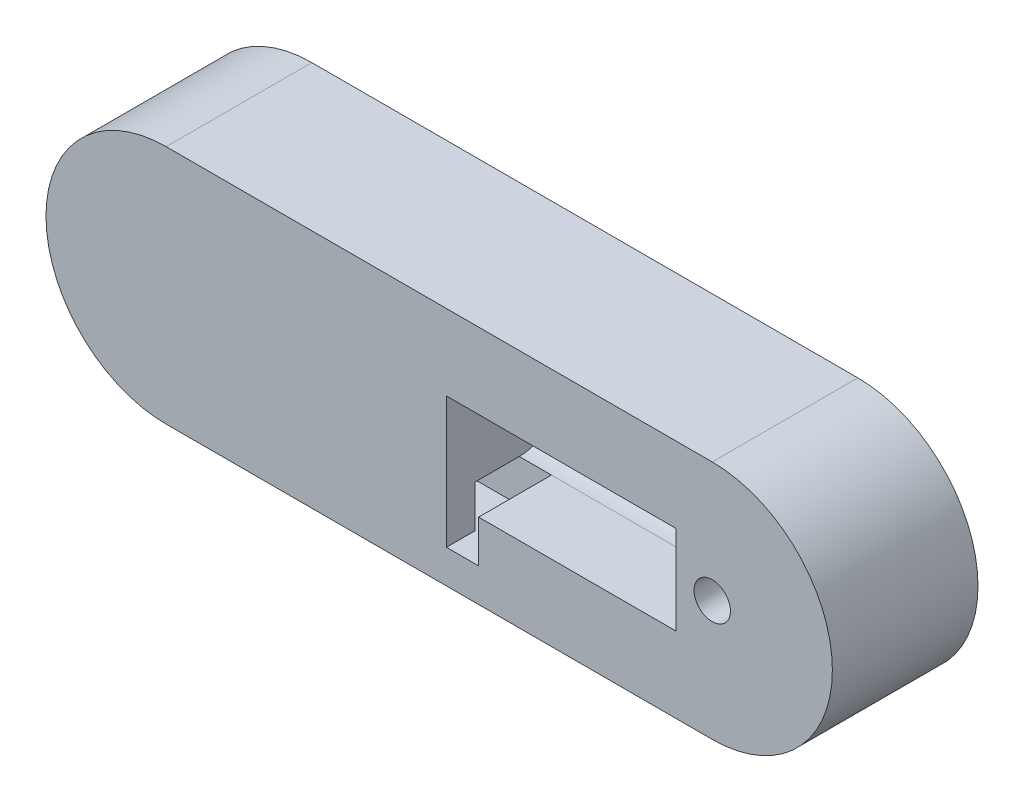
ISO-10303-21;
HEADER;
FILE_DESCRIPTION(('STEP AP214'),'2;1');
FILE_NAME('part.step','',(''),(''),'','','');
FILE_SCHEMA(('AUTOMOTIVE_DESIGN { 1 0 10303 214 1 1 1 1 }'));
ENDSEC;
DATA;
#1=APPLICATION_CONTEXT('core data for automotive mechanical design processes');
#2=APPLICATION_PROTOCOL_DEFINITION('international standard','automotive_design',2000,#1);
#3=PRODUCT_CONTEXT('',#1,'mechanical');
#4=PRODUCT('Part','Part','',(#3));
#5=PRODUCT_RELATED_PRODUCT_CATEGORY('part','',(#4));
#6=PRODUCT_DEFINITION_FORMATION('','',#4);
#7=PRODUCT_DEFINITION_CONTEXT('part definition',#1,'design');
#8=PRODUCT_DEFINITION('design','',#6,#7);
#9=PRODUCT_DEFINITION_SHAPE('','',#8);
#10=(LENGTH_UNIT() NAMED_UNIT(*) SI_UNIT(.MILLI.,.METRE.));
#11=(NAMED_UNIT(*) PLANE_ANGLE_UNIT() SI_UNIT($,.RADIAN.));
#12=(NAMED_UNIT(*) SI_UNIT($,.STERADIAN.) SOLID_ANGLE_UNIT());
#13=UNCERTAINTY_MEASURE_WITH_UNIT(LENGTH_MEASURE(1.E-05),#10,'distance_accuracy_value','');
#14=(GEOMETRIC_REPRESENTATION_CONTEXT(3) GLOBAL_UNCERTAINTY_ASSIGNED_CONTEXT((#13)) GLOBAL_UNIT_ASSIGNED_CONTEXT((#10,
#11,#12)) REPRESENTATION_CONTEXT('',''));
#15=CARTESIAN_POINT('',(0.,0.,0.));
#16=DIRECTION('',(0.,0.,1.));
#17=DIRECTION('',(1.,0.,0.));
#18=AXIS2_PLACEMENT_3D('',#15,#16,#17);
#19=CARTESIAN_POINT('',(0.,0.,20.));
#20=DIRECTION('',(0.,0.,1.));
#21=DIRECTION('',(1.,0.,0.));
#22=AXIS2_PLACEMENT_3D('',#19,#20,#21);
#23=PLANE('',#22);
#24=DIRECTION('',(1.,0.,0.));
#25=VECTOR('',#24,1.);
#26=CARTESIAN_POINT('',(-32.0271109618936,-12.2,20.));
#27=LINE('',#26,#25);
#28=CARTESIAN_POINT('',(-20.4271109618936,-12.2,20.));
#29=VERTEX_POINT('',#28);
#30=CARTESIAN_POINT('',(33.9728890381064,-12.2,20.));
#31=VERTEX_POINT('',#30);
#32=EDGE_CURVE('E242',#29,#31,#27,.T.);
#33=ORIENTED_EDGE('',*,*,#32,.F.);
#34=DIRECTION('',(0.,-1.,0.));
#35=VECTOR('',#34,1.);
#36=CARTESIAN_POINT('',(-20.4271109618936,-23.8,20.));
#37=LINE('',#36,#35);
#38=CARTESIAN_POINT('',(-20.4271109618936,-23.8,20.));
#39=VERTEX_POINT('',#38);
#40=EDGE_CURVE('E208',#29,#39,#37,.T.);
#41=ORIENTED_EDGE('',*,*,#40,.T.);
#42=DIRECTION('',(1.,0.,0.));
#43=VECTOR('',#42,1.);
#44=CARTESIAN_POINT('',(0.,-23.8,20.));
#45=LINE('',#44,#43);
#46=CARTESIAN_POINT('',(42.8059275424503,-23.8,20.));
#47=VERTEX_POINT('',#46);
#48=EDGE_CURVE('E201',#39,#47,#45,.T.);
#49=ORIENTED_EDGE('',*,*,#48,.T.);
#50=DIRECTION('',(0.,1.,0.));
#51=VECTOR('',#50,1.);
#52=CARTESIAN_POINT('',(42.8059275424503,0.,20.));
#53=LINE('',#52,#51);
#54=CARTESIAN_POINT('',(42.8059275424504,-12.2,20.));
#55=VERTEX_POINT('',#54);
#56=EDGE_CURVE('E322',#47,#55,#53,.T.);
#57=ORIENTED_EDGE('',*,*,#56,.T.);
#58=DIRECTION('',(-1.,0.,0.));
#59=VECTOR('',#58,1.);
#60=CARTESIAN_POINT('',(137.373384084578,-12.2,20.));
#61=LINE('',#60,#59);
#62=EDGE_CURVE('E443',#55,#31,#61,.T.);
#63=ORIENTED_EDGE('',*,*,#62,.T.);
#64=EDGE_LOOP('',(#33,#41,#49,#57,#63));
#65=FACE_BOUND('',#64,.T.);
#66=ADVANCED_FACE('F48',(#65),#23,.T.);
#67=CARTESIAN_POINT('',(33.9728890381064,0.,20.));
#68=DIRECTION('',(-1.,0.,0.));
#69=DIRECTION('',(0.,-1.,0.));
#70=AXIS2_PLACEMENT_3D('',#67,#68,#69);
#71=PLANE('',#70);
#72=DIRECTION('',(0.,0.,1.));
#73=VECTOR('',#72,1.);
#74=CARTESIAN_POINT('',(33.9728890381064,-12.2,0.));
#75=LINE('',#74,#73);
#76=CARTESIAN_POINT('',(33.9728890381064,-12.2,32.2));
#77=VERTEX_POINT('',#76);
#78=EDGE_CURVE('E217',#31,#77,#75,.T.);
#79=ORIENTED_EDGE('',*,*,#78,.F.);
#80=CARTESIAN_POINT('',(33.9728890381064,0.,20.));
#81=DIRECTION('',(1.,0.,0.));
#82=DIRECTION('',(0.,1.,0.));
#83=AXIS2_PLACEMENT_3D('',#80,#81,#82);
#84=CIRCLE('',#83,12.2);
#85=CARTESIAN_POINT('',(33.9728890381064,12.2,20.));
#86=VERTEX_POINT('',#85);
#87=EDGE_CURVE('E307',#31,#86,#84,.T.);
#88=ORIENTED_EDGE('',*,*,#87,.T.);
#89=DIRECTION('',(0.,0.,1.));
#90=VECTOR('',#89,1.);
#91=CARTESIAN_POINT('',(33.9728890381064,12.2,20.));
#92=LINE('',#91,#90);
#93=CARTESIAN_POINT('',(33.9728890381064,12.2,40.));
#94=VERTEX_POINT('',#93);
#95=EDGE_CURVE('E368',#86,#94,#92,.T.);
#96=ORIENTED_EDGE('',*,*,#95,.T.);
#97=DIRECTION('',(0.,-1.,0.));
#98=VECTOR('',#97,1.);
#99=CARTESIAN_POINT('',(33.9728890381064,0.,40.));
#100=LINE('',#99,#98);
#101=CARTESIAN_POINT('',(33.9728890381064,-23.8,40.));
#102=VERTEX_POINT('',#101);
#103=EDGE_CURVE('E344',#94,#102,#100,.T.);
#104=ORIENTED_EDGE('',*,*,#103,.T.);
#105=DIRECTION('',(0.,0.,1.));
#106=VECTOR('',#105,1.);
#107=CARTESIAN_POINT('',(33.9728890381064,-23.8,20.));
#108=LINE('',#107,#106);
#109=CARTESIAN_POINT('',(33.9728890381064,-23.8,32.2));
#110=VERTEX_POINT('',#109);
#111=EDGE_CURVE('E362',#110,#102,#108,.T.);
#112=ORIENTED_EDGE('',*,*,#111,.F.);
#113=DIRECTION('',(0.,-1.,0.));
#114=VECTOR('',#113,1.);
#115=CARTESIAN_POINT('',(33.9728890381064,0.,32.2));
#116=LINE('',#115,#114);
#117=EDGE_CURVE('E236',#77,#110,#116,.T.);
#118=ORIENTED_EDGE('',*,*,#117,.F.);
#119=EDGE_LOOP('',(#79,#88,#96,#104,#112,#118));
#120=FACE_BOUND('',#119,.T.);
#121=ADVANCED_FACE('F477',(#120),#71,.F.);
#122=CARTESIAN_POINT('',(106.972889038106,0.,40.));
#123=DIRECTION('',(0.,0.,-1.));
#124=DIRECTION('',(-1.,0.,0.));
#125=AXIS2_PLACEMENT_3D('',#122,#123,#124);
#126=CYLINDRICAL_SURFACE('',#125,5.);
#127=CARTESIAN_POINT('',(106.972889038106,0.,0.));
#128=DIRECTION('',(0.,0.,1.));
#129=DIRECTION('',(1.,0.,0.));
#130=AXIS2_PLACEMENT_3D('',#127,#128,#129);
#131=CIRCLE('',#130,5.);
#132=CARTESIAN_POINT('',(111.972889038106,0.,0.));
#133=VERTEX_POINT('',#132);
#134=EDGE_CURVE('E400',#133,#133,#131,.T.);
#135=ORIENTED_EDGE('',*,*,#134,.F.);
#136=EDGE_LOOP('',(#135));
#137=FACE_BOUND('',#136,.T.);
#138=CARTESIAN_POINT('',(106.972889038106,0.,7.80000000000001));
#139=DIRECTION('',(0.,0.,1.));
#140=DIRECTION('',(1.,0.,0.));
#141=AXIS2_PLACEMENT_3D('',#138,#139,#140);
#142=CIRCLE('',#141,5.);
#143=CARTESIAN_POINT('',(111.972889038106,0.,7.80000000000001));
#144=VERTEX_POINT('',#143);
#145=EDGE_CURVE('E294',#144,#144,#142,.T.);
#146=ORIENTED_EDGE('',*,*,#145,.T.);
#147=EDGE_LOOP('',(#146));
#148=FACE_BOUND('',#147,.T.);
#149=ADVANCED_FACE('F545',(#137,#148),#126,.F.);
#150=CARTESIAN_POINT('',(96.9728890381064,0.,20.));
#151=DIRECTION('',(1.,0.,0.));
#152=DIRECTION('',(0.,0.,-1.));
#153=AXIS2_PLACEMENT_3D('',#150,#151,#152);
#154=PLANE('',#153);
#155=DIRECTION('',(0.,1.,0.));
#156=VECTOR('',#155,1.);
#157=CARTESIAN_POINT('',(96.9728890381064,0.,32.2));
#158=LINE('',#157,#156);
#159=CARTESIAN_POINT('',(96.9728890381064,-12.2,32.2));
#160=VERTEX_POINT('',#159);
#161=CARTESIAN_POINT('',(96.9728890381064,12.2,32.2));
#162=VERTEX_POINT('',#161);
#163=EDGE_CURVE('E277',#160,#162,#158,.T.);
#164=ORIENTED_EDGE('',*,*,#163,.F.);
#165=DIRECTION('',(0.,0.,1.));
#166=VECTOR('',#165,1.);
#167=CARTESIAN_POINT('',(96.9728890381064,-12.2,20.));
#168=LINE('',#167,#166);
#169=CARTESIAN_POINT('',(96.9728890381064,-12.2,40.));
#170=VERTEX_POINT('',#169);
#171=EDGE_CURVE('E351',#160,#170,#168,.T.);
#172=ORIENTED_EDGE('',*,*,#171,.T.);
#173=DIRECTION('',(0.,1.,0.));
#174=VECTOR('',#173,1.);
#175=CARTESIAN_POINT('',(96.9728890381064,0.,40.));
#176=LINE('',#175,#174);
#177=CARTESIAN_POINT('',(96.9728890381064,12.2,40.));
#178=VERTEX_POINT('',#177);
#179=EDGE_CURVE('E312',#170,#178,#176,.T.);
#180=ORIENTED_EDGE('',*,*,#179,.T.);
#181=DIRECTION('',(0.,0.,1.));
#182=VECTOR('',#181,1.);
#183=CARTESIAN_POINT('',(96.9728890381064,12.2,20.));
#184=LINE('',#183,#182);
#185=EDGE_CURVE('E332',#162,#178,#184,.T.);
#186=ORIENTED_EDGE('',*,*,#185,.F.);
#187=EDGE_LOOP('',(#164,#172,#180,#186));
#188=FACE_BOUND('',#187,.T.);
#189=ADVANCED_FACE('F502',(#188),#154,.F.);
#190=CARTESIAN_POINT('',(0.,0.,0.));
#191=DIRECTION('',(0.,0.,1.));
#192=DIRECTION('',(1.,0.,0.));
#193=AXIS2_PLACEMENT_3D('',#190,#191,#192);
#194=PLANE('',#193);
#195=DIRECTION('',(1.,0.,0.));
#196=VECTOR('',#195,1.);
#197=CARTESIAN_POINT('',(-32.0271109618936,-12.2,0.));
#198=LINE('',#197,#196);
#199=CARTESIAN_POINT('',(-42.0271109618936,-12.2,0.));
#200=VERTEX_POINT('',#199);
#201=CARTESIAN_POINT('',(-20.4271109618936,-12.2,0.));
#202=VERTEX_POINT('',#201);
#203=EDGE_CURVE('E62',#200,#202,#198,.T.);
#204=ORIENTED_EDGE('',*,*,#203,.F.);
#205=DIRECTION('',(0.,-1.,0.));
#206=VECTOR('',#205,1.);
#207=CARTESIAN_POINT('',(-42.0271109618936,-23.8,0.));
#208=LINE('',#207,#206);
#209=CARTESIAN_POINT('',(-42.0271109618936,-23.8,0.));
#210=VERTEX_POINT('',#209);
#211=EDGE_CURVE('E223',#200,#210,#208,.T.);
#212=ORIENTED_EDGE('',*,*,#211,.T.);
#213=DIRECTION('',(-1.,0.,0.));
#214=VECTOR('',#213,1.);
#215=CARTESIAN_POINT('',(-20.4271109618936,-23.8,0.));
#216=LINE('',#215,#214);
#217=CARTESIAN_POINT('',(-20.4271109618936,-23.8,0.));
#218=VERTEX_POINT('',#217);
#219=EDGE_CURVE('E74',#218,#210,#216,.T.);
#220=ORIENTED_EDGE('',*,*,#219,.F.);
#221=DIRECTION('',(0.,-1.,0.));
#222=VECTOR('',#221,1.);
#223=CARTESIAN_POINT('',(-20.4271109618936,-23.8,0.));
#224=LINE('',#223,#222);
#225=EDGE_CURVE('E211',#202,#218,#224,.T.);
#226=ORIENTED_EDGE('',*,*,#225,.F.);
#227=EDGE_LOOP('',(#204,#212,#220,#226));
#228=FACE_BOUND('',#227,.T.);
#229=CARTESIAN_POINT('',(-43.0271109618936,0.,0.));
#230=DIRECTION('',(0.,0.,1.));
#231=DIRECTION('',(1.,0.,0.));
#232=AXIS2_PLACEMENT_3D('',#229,#230,#231);
#233=CIRCLE('',#232,33.);
#234=CARTESIAN_POINT('',(-43.0271109618936,33.,0.));
#235=VERTEX_POINT('',#234);
#236=CARTESIAN_POINT('',(-43.0271109618936,-33.,0.));
#237=VERTEX_POINT('',#236);
#238=EDGE_CURVE('E393',#235,#237,#233,.T.);
#239=ORIENTED_EDGE('',*,*,#238,.F.);
#240=DIRECTION('',(1.,0.,0.));
#241=VECTOR('',#240,1.);
#242=CARTESIAN_POINT('',(0.,33.,0.));
#243=LINE('',#242,#241);
#244=CARTESIAN_POINT('',(106.972889038106,33.,0.));
#245=VERTEX_POINT('',#244);
#246=EDGE_CURVE('E425',#235,#245,#243,.T.);
#247=ORIENTED_EDGE('',*,*,#246,.T.);
#248=CARTESIAN_POINT('',(106.972889038106,0.,0.));
#249=DIRECTION('',(0.,0.,1.));
#250=DIRECTION('',(1.,0.,0.));
#251=AXIS2_PLACEMENT_3D('',#248,#249,#250);
#252=CIRCLE('',#251,33.);
#253=CARTESIAN_POINT('',(106.972889038106,-33.,0.));
#254=VERTEX_POINT('',#253);
#255=EDGE_CURVE('E416',#254,#245,#252,.T.);
#256=ORIENTED_EDGE('',*,*,#255,.F.);
#257=DIRECTION('',(1.,0.,0.));
#258=VECTOR('',#257,1.);
#259=CARTESIAN_POINT('',(0.,-33.,0.));
#260=LINE('',#259,#258);
#261=EDGE_CURVE('E419',#237,#254,#260,.T.);
#262=ORIENTED_EDGE('',*,*,#261,.F.);
#263=EDGE_LOOP('',(#239,#247,#256,#262));
#264=FACE_BOUND('',#263,.T.);
#265=ORIENTED_EDGE('',*,*,#134,.T.);
#266=EDGE_LOOP('',(#265));
#267=FACE_BOUND('',#266,.T.);
#268=CARTESIAN_POINT('',(-43.0271109618936,0.,0.));
#269=DIRECTION('',(0.,0.,1.));
#270=DIRECTION('',(1.,0.,0.));
#271=AXIS2_PLACEMENT_3D('',#268,#269,#270);
#272=CIRCLE('',#271,2.);
#273=CARTESIAN_POINT('',(-41.5098899591176,1.3030888030888,0.));
#274=VERTEX_POINT('',#273);
#275=CARTESIAN_POINT('',(-41.5098899591176,-1.3030888030888,0.));
#276=VERTEX_POINT('',#275);
#277=EDGE_CURVE('E377',#274,#276,#272,.T.);
#278=ORIENTED_EDGE('',*,*,#277,.T.);
#279=DIRECTION('',(0.,-1.,0.));
#280=VECTOR('',#279,1.);
#281=CARTESIAN_POINT('',(-41.5098899591176,0.,0.));
#282=LINE('',#281,#280);
#283=EDGE_CURVE('E356',#274,#276,#282,.T.);
#284=ORIENTED_EDGE('',*,*,#283,.F.);
#285=EDGE_LOOP('',(#278,#284));
#286=FACE_BOUND('',#285,.T.);
#287=ADVANCED_FACE('F218',(#228,#264,#267,#286),#194,.F.);
#288=CARTESIAN_POINT('',(-43.0271109618936,0.,40.));
#289=DIRECTION('',(0.,0.,-1.));
#290=DIRECTION('',(-1.,0.,0.));
#291=AXIS2_PLACEMENT_3D('',#288,#289,#290);
#292=CYLINDRICAL_SURFACE('',#291,33.);
#293=ORIENTED_EDGE('',*,*,#238,.T.);
#294=DIRECTION('',(0.,0.,-1.));
#295=VECTOR('',#294,1.);
#296=CARTESIAN_POINT('',(-43.0271109618936,-33.,40.));
#297=LINE('',#296,#295);
#298=CARTESIAN_POINT('',(-43.0271109618936,-33.,40.));
#299=VERTEX_POINT('',#298);
#300=EDGE_CURVE('E439',#299,#237,#297,.T.);
#301=ORIENTED_EDGE('',*,*,#300,.F.);
#302=CARTESIAN_POINT('',(-43.0271109618936,0.,40.));
#303=DIRECTION('',(0.,0.,1.));
#304=DIRECTION('',(1.,0.,0.));
#305=AXIS2_PLACEMENT_3D('',#302,#303,#304);
#306=CIRCLE('',#305,33.);
#307=CARTESIAN_POINT('',(-43.0271109618936,33.,40.));
#308=VERTEX_POINT('',#307);
#309=EDGE_CURVE('E394',#308,#299,#306,.T.);
#310=ORIENTED_EDGE('',*,*,#309,.F.);
#311=DIRECTION('',(0.,0.,-1.));
#312=VECTOR('',#311,1.);
#313=CARTESIAN_POINT('',(-43.0271109618936,33.,40.));
#314=LINE('',#313,#312);
#315=EDGE_CURVE('E413',#308,#235,#314,.T.);
#316=ORIENTED_EDGE('',*,*,#315,.T.);
#317=EDGE_LOOP('',(#293,#301,#310,#316));
#318=FACE_BOUND('',#317,.T.);
#319=ADVANCED_FACE('F575',(#318),#292,.T.);
#320=CARTESIAN_POINT('',(0.,-33.,40.));
#321=DIRECTION('',(0.,1.,0.));
#322=DIRECTION('',(0.,0.,1.));
#323=AXIS2_PLACEMENT_3D('',#320,#321,#322);
#324=PLANE('',#323);
#325=ORIENTED_EDGE('',*,*,#261,.T.);
#326=DIRECTION('',(0.,0.,-1.));
#327=VECTOR('',#326,1.);
#328=CARTESIAN_POINT('',(106.972889038106,-33.,40.));
#329=LINE('',#328,#327);
#330=CARTESIAN_POINT('',(106.972889038106,-33.,40.));
#331=VERTEX_POINT('',#330);
#332=EDGE_CURVE('E436',#331,#254,#329,.T.);
#333=ORIENTED_EDGE('',*,*,#332,.F.);
#334=DIRECTION('',(1.,0.,0.));
#335=VECTOR('',#334,1.);
#336=CARTESIAN_POINT('',(0.,-33.,40.));
#337=LINE('',#336,#335);
#338=EDGE_CURVE('E397',#299,#331,#337,.T.);
#339=ORIENTED_EDGE('',*,*,#338,.F.);
#340=ORIENTED_EDGE('',*,*,#300,.T.);
#341=EDGE_LOOP('',(#325,#333,#339,#340));
#342=FACE_BOUND('',#341,.T.);
#343=ADVANCED_FACE('F585',(#342),#324,.F.);
#344=CARTESIAN_POINT('',(106.972889038106,0.,40.));
#345=DIRECTION('',(0.,0.,-1.));
#346=DIRECTION('',(-1.,0.,0.));
#347=AXIS2_PLACEMENT_3D('',#344,#345,#346);
#348=CYLINDRICAL_SURFACE('',#347,33.);
#349=ORIENTED_EDGE('',*,*,#255,.T.);
#350=DIRECTION('',(0.,0.,-1.));
#351=VECTOR('',#350,1.);
#352=CARTESIAN_POINT('',(106.972889038106,33.,40.));
#353=LINE('',#352,#351);
#354=CARTESIAN_POINT('',(106.972889038106,33.,40.));
#355=VERTEX_POINT('',#354);
#356=EDGE_CURVE('E433',#355,#245,#353,.T.);
#357=ORIENTED_EDGE('',*,*,#356,.F.);
#358=CARTESIAN_POINT('',(106.972889038106,0.,40.));
#359=DIRECTION('',(0.,0.,1.));
#360=DIRECTION('',(1.,0.,0.));
#361=AXIS2_PLACEMENT_3D('',#358,#359,#360);
#362=CIRCLE('',#361,33.);
#363=EDGE_CURVE('E405',#331,#355,#362,.T.);
#364=ORIENTED_EDGE('',*,*,#363,.F.);
#365=ORIENTED_EDGE('',*,*,#332,.T.);
#366=EDGE_LOOP('',(#349,#357,#364,#365));
#367=FACE_BOUND('',#366,.T.);
#368=ADVANCED_FACE('F576',(#367),#348,.T.);
#369=CARTESIAN_POINT('',(0.,33.,40.));
#370=DIRECTION('',(0.,1.,0.));
#371=DIRECTION('',(0.,0.,1.));
#372=AXIS2_PLACEMENT_3D('',#369,#370,#371);
#373=PLANE('',#372);
#374=ORIENTED_EDGE('',*,*,#246,.F.);
#375=ORIENTED_EDGE('',*,*,#315,.F.);
#376=DIRECTION('',(1.,0.,0.));
#377=VECTOR('',#376,1.);
#378=CARTESIAN_POINT('',(0.,33.,40.));
#379=LINE('',#378,#377);
#380=EDGE_CURVE('E403',#308,#355,#379,.T.);
#381=ORIENTED_EDGE('',*,*,#380,.T.);
#382=ORIENTED_EDGE('',*,*,#356,.T.);
#383=EDGE_LOOP('',(#374,#375,#381,#382));
#384=FACE_BOUND('',#383,.T.);
#385=ADVANCED_FACE('F574',(#384),#373,.T.);
#386=CARTESIAN_POINT('',(106.972889038106,0.,32.2));
#387=DIRECTION('',(0.,0.,1.));
#388=DIRECTION('',(1.,0.,0.));
#389=AXIS2_PLACEMENT_3D('',#386,#387,#388);
#390=CIRCLE('',#389,5.);
#391=CARTESIAN_POINT('',(111.972889038106,0.,32.2));
#392=VERTEX_POINT('',#391);
#393=EDGE_CURVE('E308',#392,#392,#390,.T.);
#394=ORIENTED_EDGE('',*,*,#393,.F.);
#395=EDGE_LOOP('',(#394));
#396=FACE_BOUND('',#395,.T.);
#397=CARTESIAN_POINT('',(106.972889038106,0.,40.));
#398=DIRECTION('',(0.,0.,1.));
#399=DIRECTION('',(1.,0.,0.));
#400=AXIS2_PLACEMENT_3D('',#397,#398,#399);
#401=CIRCLE('',#400,5.);
#402=CARTESIAN_POINT('',(111.972889038106,0.,40.));
#403=VERTEX_POINT('',#402);
#404=EDGE_CURVE('E408',#403,#403,#401,.T.);
#405=ORIENTED_EDGE('',*,*,#404,.T.);
#406=EDGE_LOOP('',(#405));
#407=FACE_BOUND('',#406,.T.);
#408=ADVANCED_FACE('F567',(#396,#407),#126,.F.);
#409=CARTESIAN_POINT('',(0.,0.,40.));
#410=DIRECTION('',(0.,0.,1.));
#411=DIRECTION('',(1.,0.,0.));
#412=AXIS2_PLACEMENT_3D('',#409,#410,#411);
#413=PLANE('',#412);
#414=ORIENTED_EDGE('',*,*,#179,.F.);
#415=DIRECTION('',(1.,0.,0.));
#416=VECTOR('',#415,1.);
#417=CARTESIAN_POINT('',(0.,-12.2,40.));
#418=LINE('',#417,#416);
#419=CARTESIAN_POINT('',(42.8059275424503,-12.2,40.));
#420=VERTEX_POINT('',#419);
#421=EDGE_CURVE('E321',#420,#170,#418,.T.);
#422=ORIENTED_EDGE('',*,*,#421,.F.);
#423=DIRECTION('',(0.,1.,0.));
#424=VECTOR('',#423,1.);
#425=CARTESIAN_POINT('',(42.8059275424503,0.,40.));
#426=LINE('',#425,#424);
#427=CARTESIAN_POINT('',(42.8059275424503,-23.8,40.));
#428=VERTEX_POINT('',#427);
#429=EDGE_CURVE('E348',#428,#420,#426,.T.);
#430=ORIENTED_EDGE('',*,*,#429,.F.);
#431=DIRECTION('',(1.,0.,0.));
#432=VECTOR('',#431,1.);
#433=CARTESIAN_POINT('',(0.,-23.8,40.));
#434=LINE('',#433,#432);
#435=EDGE_CURVE('E342',#102,#428,#434,.T.);
#436=ORIENTED_EDGE('',*,*,#435,.F.);
#437=ORIENTED_EDGE('',*,*,#103,.F.);
#438=DIRECTION('',(-1.,0.,0.));
#439=VECTOR('',#438,1.);
#440=CARTESIAN_POINT('',(0.,12.2,40.));
#441=LINE('',#440,#439);
#442=EDGE_CURVE('E340',#178,#94,#441,.T.);
#443=ORIENTED_EDGE('',*,*,#442,.F.);
#444=EDGE_LOOP('',(#414,#422,#430,#436,#437,#443));
#445=FACE_BOUND('',#444,.T.);
#446=ORIENTED_EDGE('',*,*,#309,.T.);
#447=ORIENTED_EDGE('',*,*,#338,.T.);
#448=ORIENTED_EDGE('',*,*,#363,.T.);
#449=ORIENTED_EDGE('',*,*,#380,.F.);
#450=EDGE_LOOP('',(#446,#447,#448,#449));
#451=FACE_BOUND('',#450,.T.);
#452=ORIENTED_EDGE('',*,*,#404,.F.);
#453=EDGE_LOOP('',(#452));
#454=FACE_BOUND('',#453,.T.);
#455=ADVANCED_FACE('F483',(#445,#451,#454),#413,.T.);
#456=CARTESIAN_POINT('',(-41.5098899591176,0.,10.));
#457=DIRECTION('',(1.,0.,0.));
#458=DIRECTION('',(0.,0.,-1.));
#459=AXIS2_PLACEMENT_3D('',#456,#457,#458);
#460=PLANE('',#459);
#461=ORIENTED_EDGE('',*,*,#283,.T.);
#462=DIRECTION('',(0.,0.,-1.));
#463=VECTOR('',#462,1.);
#464=CARTESIAN_POINT('',(-41.5098899591176,-1.3030888030888,10.));
#465=LINE('',#464,#463);
#466=CARTESIAN_POINT('',(-41.5098899591176,-1.3030888030888,10.));
#467=VERTEX_POINT('',#466);
#468=EDGE_CURVE('E382',#467,#276,#465,.T.);
#469=ORIENTED_EDGE('',*,*,#468,.F.);
#470=DIRECTION('',(0.,-1.,0.));
#471=VECTOR('',#470,1.);
#472=CARTESIAN_POINT('',(-41.5098899591176,0.,10.));
#473=LINE('',#472,#471);
#474=CARTESIAN_POINT('',(-41.5098899591176,1.3030888030888,10.));
#475=VERTEX_POINT('',#474);
#476=EDGE_CURVE('E373',#475,#467,#473,.T.);
#477=ORIENTED_EDGE('',*,*,#476,.F.);
#478=DIRECTION('',(0.,0.,-1.));
#479=VECTOR('',#478,1.);
#480=CARTESIAN_POINT('',(-41.5098899591176,1.3030888030888,10.));
#481=LINE('',#480,#479);
#482=EDGE_CURVE('E387',#475,#274,#481,.T.);
#483=ORIENTED_EDGE('',*,*,#482,.T.);
#484=EDGE_LOOP('',(#461,#469,#477,#483));
#485=FACE_BOUND('',#484,.T.);
#486=ADVANCED_FACE('F565',(#485),#460,.F.);
#487=CARTESIAN_POINT('',(-43.0271109618936,0.,10.));
#488=DIRECTION('',(0.,0.,-1.));
#489=DIRECTION('',(-1.,0.,0.));
#490=AXIS2_PLACEMENT_3D('',#487,#488,#489);
#491=CYLINDRICAL_SURFACE('',#490,2.);
#492=ORIENTED_EDGE('',*,*,#277,.F.);
#493=ORIENTED_EDGE('',*,*,#482,.F.);
#494=CARTESIAN_POINT('',(-43.0271109618936,0.,10.));
#495=DIRECTION('',(0.,0.,1.));
#496=DIRECTION('',(1.,0.,0.));
#497=AXIS2_PLACEMENT_3D('',#494,#495,#496);
#498=CIRCLE('',#497,2.);
#499=EDGE_CURVE('E380',#475,#467,#498,.T.);
#500=ORIENTED_EDGE('',*,*,#499,.T.);
#501=ORIENTED_EDGE('',*,*,#468,.T.);
#502=EDGE_LOOP('',(#492,#493,#500,#501));
#503=FACE_BOUND('',#502,.T.);
#504=ADVANCED_FACE('F556',(#503),#491,.F.);
#505=CARTESIAN_POINT('',(0.,0.,10.));
#506=DIRECTION('',(0.,0.,1.));
#507=DIRECTION('',(1.,0.,0.));
#508=AXIS2_PLACEMENT_3D('',#505,#506,#507);
#509=PLANE('',#508);
#510=ORIENTED_EDGE('',*,*,#476,.T.);
#511=ORIENTED_EDGE('',*,*,#499,.F.);
#512=EDGE_LOOP('',(#510,#511));
#513=FACE_BOUND('',#512,.T.);
#514=ADVANCED_FACE('F547',(#513),#509,.F.);
#515=CARTESIAN_POINT('',(0.,-12.2,20.));
#516=DIRECTION('',(0.,-1.,0.));
#517=DIRECTION('',(0.,0.,-1.));
#518=AXIS2_PLACEMENT_3D('',#515,#516,#517);
#519=PLANE('',#518);
#520=ORIENTED_EDGE('',*,*,#421,.T.);
#521=ORIENTED_EDGE('',*,*,#171,.F.);
#522=DIRECTION('',(-1.,0.,0.));
#523=VECTOR('',#522,1.);
#524=CARTESIAN_POINT('',(126.972889038106,-12.2,32.2));
#525=LINE('',#524,#523);
#526=CARTESIAN_POINT('',(126.972889038106,-12.2,32.2));
#527=VERTEX_POINT('',#526);
#528=EDGE_CURVE('E279',#527,#160,#525,.T.);
#529=ORIENTED_EDGE('',*,*,#528,.F.);
#530=DIRECTION('',(0.,0.,1.));
#531=VECTOR('',#530,1.);
#532=CARTESIAN_POINT('',(126.972889038106,-12.2,0.));
#533=LINE('',#532,#531);
#534=CARTESIAN_POINT('',(126.972889038106,-12.2,7.80000000000001));
#535=VERTEX_POINT('',#534);
#536=EDGE_CURVE('E257',#535,#527,#533,.T.);
#537=ORIENTED_EDGE('',*,*,#536,.F.);
#538=DIRECTION('',(-1.,0.,0.));
#539=VECTOR('',#538,1.);
#540=CARTESIAN_POINT('',(126.972889038106,-12.2,7.80000000000001));
#541=LINE('',#540,#539);
#542=CARTESIAN_POINT('',(96.9728890381064,-12.2,7.80000000000001));
#543=VERTEX_POINT('',#542);
#544=EDGE_CURVE('E292',#535,#543,#541,.T.);
#545=ORIENTED_EDGE('',*,*,#544,.T.);
#546=DIRECTION('',(0.,0.,1.));
#547=VECTOR('',#546,1.);
#548=CARTESIAN_POINT('',(96.9728890381064,-12.2,0.));
#549=LINE('',#548,#547);
#550=CARTESIAN_POINT('',(96.9728890381064,-12.2,20.));
#551=VERTEX_POINT('',#550);
#552=EDGE_CURVE('E254',#543,#551,#549,.T.);
#553=ORIENTED_EDGE('',*,*,#552,.T.);
#554=DIRECTION('',(1.,0.,0.));
#555=VECTOR('',#554,1.);
#556=CARTESIAN_POINT('',(0.,-12.2,20.));
#557=LINE('',#556,#555);
#558=EDGE_CURVE('E329',#55,#551,#557,.T.);
#559=ORIENTED_EDGE('',*,*,#558,.F.);
#560=DIRECTION('',(0.,0.,1.));
#561=VECTOR('',#560,1.);
#562=CARTESIAN_POINT('',(42.8059275424503,-12.2,20.));
#563=LINE('',#562,#561);
#564=EDGE_CURVE('E360',#55,#420,#563,.T.);
#565=ORIENTED_EDGE('',*,*,#564,.T.);
#566=EDGE_LOOP('',(#520,#521,#529,#537,#545,#553,#559,#565));
#567=FACE_BOUND('',#566,.T.);
#568=ADVANCED_FACE('F495',(#567),#519,.F.);
#569=CARTESIAN_POINT('',(42.8059275424503,0.,20.));
#570=DIRECTION('',(1.,0.,0.));
#571=DIRECTION('',(0.,0.,-1.));
#572=AXIS2_PLACEMENT_3D('',#569,#570,#571);
#573=PLANE('',#572);
#574=ORIENTED_EDGE('',*,*,#429,.T.);
#575=ORIENTED_EDGE('',*,*,#564,.F.);
#576=ORIENTED_EDGE('',*,*,#56,.F.);
#577=DIRECTION('',(0.,0.,1.));
#578=VECTOR('',#577,1.);
#579=CARTESIAN_POINT('',(42.8059275424503,-23.8,20.));
#580=LINE('',#579,#578);
#581=EDGE_CURVE('E365',#47,#428,#580,.T.);
#582=ORIENTED_EDGE('',*,*,#581,.T.);
#583=EDGE_LOOP('',(#574,#575,#576,#582));
#584=FACE_BOUND('',#583,.T.);
#585=ADVANCED_FACE('F488',(#584),#573,.F.);
#586=CARTESIAN_POINT('',(0.,-23.8,20.));
#587=DIRECTION('',(0.,-1.,0.));
#588=DIRECTION('',(1.,0.,0.));
#589=AXIS2_PLACEMENT_3D('',#586,#587,#588);
#590=PLANE('',#589);
#591=ORIENTED_EDGE('',*,*,#435,.T.);
#592=ORIENTED_EDGE('',*,*,#581,.F.);
#593=ORIENTED_EDGE('',*,*,#48,.F.);
#594=DIRECTION('',(0.,0.,-1.));
#595=VECTOR('',#594,1.);
#596=CARTESIAN_POINT('',(-20.4271109618936,-23.8,40.001));
#597=LINE('',#596,#595);
#598=EDGE_CURVE('E196',#39,#218,#597,.T.);
#599=ORIENTED_EDGE('',*,*,#598,.T.);
#600=ORIENTED_EDGE('',*,*,#219,.T.);
#601=DIRECTION('',(0.707106781186549,0.,0.707106781186547));
#602=VECTOR('',#601,1.);
#603=CARTESIAN_POINT('',(-11.0135554809467,-23.8,31.0135554809468));
#604=LINE('',#603,#602);
#605=CARTESIAN_POINT('',(-32.0271109618936,-23.8,9.99999999999998));
#606=VERTEX_POINT('',#605);
#607=EDGE_CURVE('E11',#210,#606,#604,.T.);
#608=ORIENTED_EDGE('',*,*,#607,.T.);
#609=DIRECTION('',(0.,0.,-1.));
#610=VECTOR('',#609,1.);
#611=CARTESIAN_POINT('',(-32.0271109618936,-23.8,0.));
#612=LINE('',#611,#610);
#613=CARTESIAN_POINT('',(-32.0271109618936,-23.8,32.2));
#614=VERTEX_POINT('',#613);
#615=EDGE_CURVE('E239',#614,#606,#612,.T.);
#616=ORIENTED_EDGE('',*,*,#615,.F.);
#617=DIRECTION('',(1.,0.,0.));
#618=VECTOR('',#617,1.);
#619=CARTESIAN_POINT('',(-32.0271109618936,-23.8,32.2));
#620=LINE('',#619,#618);
#621=EDGE_CURVE('E249',#614,#110,#620,.T.);
#622=ORIENTED_EDGE('',*,*,#621,.T.);
#623=ORIENTED_EDGE('',*,*,#111,.T.);
#624=EDGE_LOOP('',(#591,#592,#593,#599,#600,#608,#616,#622,#623));
#625=FACE_BOUND('',#624,.T.);
#626=ADVANCED_FACE('F202',(#625),#590,.F.);
#627=CARTESIAN_POINT('',(0.,12.2,20.));
#628=DIRECTION('',(0.,1.,0.));
#629=DIRECTION('',(0.,0.,1.));
#630=AXIS2_PLACEMENT_3D('',#627,#628,#629);
#631=PLANE('',#630);
#632=ORIENTED_EDGE('',*,*,#442,.T.);
#633=ORIENTED_EDGE('',*,*,#95,.F.);
#634=DIRECTION('',(-1.,0.,0.));
#635=VECTOR('',#634,1.);
#636=CARTESIAN_POINT('',(0.,12.2,20.));
#637=LINE('',#636,#635);
#638=CARTESIAN_POINT('',(96.9728890381064,12.2,20.));
#639=VERTEX_POINT('',#638);
#640=EDGE_CURVE('E316',#639,#86,#637,.T.);
#641=ORIENTED_EDGE('',*,*,#640,.F.);
#642=DIRECTION('',(0.,0.,-1.));
#643=VECTOR('',#642,1.);
#644=CARTESIAN_POINT('',(96.9728890381064,12.2,0.));
#645=LINE('',#644,#643);
#646=CARTESIAN_POINT('',(96.9728890381064,12.2,7.80000000000001));
#647=VERTEX_POINT('',#646);
#648=EDGE_CURVE('E284',#639,#647,#645,.T.);
#649=ORIENTED_EDGE('',*,*,#648,.T.);
#650=DIRECTION('',(-1.,0.,0.));
#651=VECTOR('',#650,1.);
#652=CARTESIAN_POINT('',(126.972889038106,12.2,7.80000000000001));
#653=LINE('',#652,#651);
#654=CARTESIAN_POINT('',(126.972889038106,12.2,7.80000000000001));
#655=VERTEX_POINT('',#654);
#656=EDGE_CURVE('E298',#655,#647,#653,.T.);
#657=ORIENTED_EDGE('',*,*,#656,.F.);
#658=DIRECTION('',(0.,0.,-1.));
#659=VECTOR('',#658,1.);
#660=CARTESIAN_POINT('',(126.972889038106,12.2,0.));
#661=LINE('',#660,#659);
#662=CARTESIAN_POINT('',(126.972889038106,12.2,32.2));
#663=VERTEX_POINT('',#662);
#664=EDGE_CURVE('E270',#663,#655,#661,.T.);
#665=ORIENTED_EDGE('',*,*,#664,.F.);
#666=DIRECTION('',(-1.,0.,0.));
#667=VECTOR('',#666,1.);
#668=CARTESIAN_POINT('',(126.972889038106,12.2,32.2));
#669=LINE('',#668,#667);
#670=EDGE_CURVE('E297',#663,#162,#669,.T.);
#671=ORIENTED_EDGE('',*,*,#670,.T.);
#672=ORIENTED_EDGE('',*,*,#185,.T.);
#673=EDGE_LOOP('',(#632,#633,#641,#649,#657,#665,#671,#672));
#674=FACE_BOUND('',#673,.T.);
#675=ADVANCED_FACE('F499',(#674),#631,.F.);
#676=CARTESIAN_POINT('',(137.373384084578,0.,20.));
#677=DIRECTION('',(-1.,0.,0.));
#678=DIRECTION('',(0.,0.,1.));
#679=AXIS2_PLACEMENT_3D('',#676,#677,#678);
#680=CYLINDRICAL_SURFACE('',#679,12.2);
#681=CARTESIAN_POINT('',(96.9728890381064,0.,20.));
#682=DIRECTION('',(1.,0.,0.));
#683=DIRECTION('',(0.,0.,-1.));
#684=AXIS2_PLACEMENT_3D('',#681,#682,#683);
#685=CIRCLE('',#684,12.2);
#686=CARTESIAN_POINT('',(96.9728890381064,0.,7.80000000000001));
#687=VERTEX_POINT('',#686);
#688=EDGE_CURVE('E313',#551,#687,#685,.T.);
#689=ORIENTED_EDGE('',*,*,#688,.T.);
#690=EDGE_CURVE('E319',#687,#639,#685,.T.);
#691=ORIENTED_EDGE('',*,*,#690,.T.);
#692=ORIENTED_EDGE('',*,*,#640,.T.);
#693=ORIENTED_EDGE('',*,*,#87,.F.);
#694=ORIENTED_EDGE('',*,*,#62,.F.);
#695=ORIENTED_EDGE('',*,*,#558,.T.);
#696=EDGE_LOOP('',(#689,#691,#692,#693,#694,#695));
#697=FACE_BOUND('',#696,.T.);
#698=ADVANCED_FACE('F492',(#697),#680,.F.);
#699=CARTESIAN_POINT('',(96.9728890381064,0.,0.));
#700=DIRECTION('',(-1.,0.,0.));
#701=DIRECTION('',(0.,0.,1.));
#702=AXIS2_PLACEMENT_3D('',#699,#700,#701);
#703=PLANE('',#702);
#704=ORIENTED_EDGE('',*,*,#552,.F.);
#705=DIRECTION('',(0.,1.,0.));
#706=VECTOR('',#705,1.);
#707=CARTESIAN_POINT('',(96.9728890381064,0.,7.80000000000001));
#708=LINE('',#707,#706);
#709=EDGE_CURVE('E261',#543,#687,#708,.T.);
#710=ORIENTED_EDGE('',*,*,#709,.T.);
#711=ORIENTED_EDGE('',*,*,#688,.F.);
#712=EDGE_LOOP('',(#704,#710,#711));
#713=FACE_BOUND('',#712,.T.);
#714=ADVANCED_FACE('F524',(#713),#703,.F.);
#715=EDGE_CURVE('E287',#687,#647,#708,.T.);
#716=ORIENTED_EDGE('',*,*,#715,.T.);
#717=ORIENTED_EDGE('',*,*,#648,.F.);
#718=ORIENTED_EDGE('',*,*,#690,.F.);
#719=EDGE_LOOP('',(#716,#717,#718));
#720=FACE_BOUND('',#719,.T.);
#721=ADVANCED_FACE('F517',(#720),#703,.F.);
#722=CARTESIAN_POINT('',(126.972889038106,0.,7.80000000000001));
#723=DIRECTION('',(0.,0.,1.));
#724=DIRECTION('',(1.,0.,0.));
#725=AXIS2_PLACEMENT_3D('',#722,#723,#724);
#726=PLANE('',#725);
#727=ORIENTED_EDGE('',*,*,#145,.F.);
#728=EDGE_LOOP('',(#727));
#729=FACE_BOUND('',#728,.T.);
#730=ORIENTED_EDGE('',*,*,#709,.F.);
#731=ORIENTED_EDGE('',*,*,#544,.F.);
#732=DIRECTION('',(0.,1.,0.));
#733=VECTOR('',#732,1.);
#734=CARTESIAN_POINT('',(126.972889038106,0.,7.80000000000001));
#735=LINE('',#734,#733);
#736=EDGE_CURVE('E271',#535,#655,#735,.T.);
#737=ORIENTED_EDGE('',*,*,#736,.T.);
#738=ORIENTED_EDGE('',*,*,#656,.T.);
#739=ORIENTED_EDGE('',*,*,#715,.F.);
#740=EDGE_LOOP('',(#730,#731,#737,#738,#739));
#741=FACE_BOUND('',#740,.T.);
#742=ADVANCED_FACE('F516',(#729,#741),#726,.T.);
#743=CARTESIAN_POINT('',(126.972889038106,0.,32.2));
#744=DIRECTION('',(0.,0.,1.));
#745=DIRECTION('',(1.,0.,0.));
#746=AXIS2_PLACEMENT_3D('',#743,#744,#745);
#747=PLANE('',#746);
#748=ORIENTED_EDGE('',*,*,#393,.T.);
#749=EDGE_LOOP('',(#748));
#750=FACE_BOUND('',#749,.T.);
#751=ORIENTED_EDGE('',*,*,#163,.T.);
#752=ORIENTED_EDGE('',*,*,#670,.F.);
#753=DIRECTION('',(0.,1.,0.));
#754=VECTOR('',#753,1.);
#755=CARTESIAN_POINT('',(126.972889038106,0.,32.2));
#756=LINE('',#755,#754);
#757=EDGE_CURVE('E264',#527,#663,#756,.T.);
#758=ORIENTED_EDGE('',*,*,#757,.F.);
#759=ORIENTED_EDGE('',*,*,#528,.T.);
#760=EDGE_LOOP('',(#751,#752,#758,#759));
#761=FACE_BOUND('',#760,.T.);
#762=ADVANCED_FACE('F508',(#750,#761),#747,.F.);
#763=CARTESIAN_POINT('',(126.972889038106,0.,0.));
#764=DIRECTION('',(-1.,0.,0.));
#765=DIRECTION('',(0.,0.,1.));
#766=AXIS2_PLACEMENT_3D('',#763,#764,#765);
#767=PLANE('',#766);
#768=ORIENTED_EDGE('',*,*,#536,.T.);
#769=ORIENTED_EDGE('',*,*,#757,.T.);
#770=ORIENTED_EDGE('',*,*,#664,.T.);
#771=ORIENTED_EDGE('',*,*,#736,.F.);
#772=EDGE_LOOP('',(#768,#769,#770,#771));
#773=FACE_BOUND('',#772,.T.);
#774=ADVANCED_FACE('F514',(#773),#767,.T.);
#775=CARTESIAN_POINT('',(-32.0271109618936,0.,32.2));
#776=DIRECTION('',(0.,0.,1.));
#777=DIRECTION('',(1.,0.,0.));
#778=AXIS2_PLACEMENT_3D('',#775,#776,#777);
#779=PLANE('',#778);
#780=ORIENTED_EDGE('',*,*,#117,.T.);
#781=ORIENTED_EDGE('',*,*,#621,.F.);
#782=DIRECTION('',(0.,-1.,0.));
#783=VECTOR('',#782,1.);
#784=CARTESIAN_POINT('',(-32.0271109618936,0.,32.2));
#785=LINE('',#784,#783);
#786=CARTESIAN_POINT('',(-32.0271109618936,-12.2,32.2));
#787=VERTEX_POINT('',#786);
#788=EDGE_CURVE('E232',#787,#614,#785,.T.);
#789=ORIENTED_EDGE('',*,*,#788,.F.);
#790=DIRECTION('',(1.,0.,0.));
#791=VECTOR('',#790,1.);
#792=CARTESIAN_POINT('',(-32.0271109618936,-12.2,32.2));
#793=LINE('',#792,#791);
#794=EDGE_CURVE('E251',#787,#77,#793,.T.);
#795=ORIENTED_EDGE('',*,*,#794,.T.);
#796=EDGE_LOOP('',(#780,#781,#789,#795));
#797=FACE_BOUND('',#796,.T.);
#798=ADVANCED_FACE('F466',(#797),#779,.F.);
#799=CARTESIAN_POINT('',(-32.0271109618936,-12.2,0.));
#800=DIRECTION('',(0.,1.,0.));
#801=DIRECTION('',(0.,0.,1.));
#802=AXIS2_PLACEMENT_3D('',#799,#800,#801);
#803=PLANE('',#802);
#804=ORIENTED_EDGE('',*,*,#78,.T.);
#805=ORIENTED_EDGE('',*,*,#794,.F.);
#806=DIRECTION('',(0.,0.,1.));
#807=VECTOR('',#806,1.);
#808=CARTESIAN_POINT('',(-32.0271109618936,-12.2,0.));
#809=LINE('',#808,#807);
#810=CARTESIAN_POINT('',(-32.0271109618936,-12.2,9.99999999999998));
#811=VERTEX_POINT('',#810);
#812=EDGE_CURVE('E235',#811,#787,#809,.T.);
#813=ORIENTED_EDGE('',*,*,#812,.F.);
#814=DIRECTION('',(-0.707106781186549,0.,-0.707106781186547));
#815=VECTOR('',#814,1.);
#816=CARTESIAN_POINT('',(-37.0271109618936,-12.2,4.99999999999999));
#817=LINE('',#816,#815);
#818=EDGE_CURVE('E59',#811,#200,#817,.T.);
#819=ORIENTED_EDGE('',*,*,#818,.T.);
#820=ORIENTED_EDGE('',*,*,#203,.T.);
#821=DIRECTION('',(0.,0.,-1.));
#822=VECTOR('',#821,1.);
#823=CARTESIAN_POINT('',(-20.4271109618936,-12.2,40.001));
#824=LINE('',#823,#822);
#825=EDGE_CURVE('E209',#29,#202,#824,.T.);
#826=ORIENTED_EDGE('',*,*,#825,.F.);
#827=ORIENTED_EDGE('',*,*,#32,.T.);
#828=EDGE_LOOP('',(#804,#805,#813,#819,#820,#826,#827));
#829=FACE_BOUND('',#828,.T.);
#830=ADVANCED_FACE('F459',(#829),#803,.F.);
#831=CARTESIAN_POINT('',(-32.0271109618936,0.,0.));
#832=DIRECTION('',(1.,0.,0.));
#833=DIRECTION('',(0.,1.,0.));
#834=AXIS2_PLACEMENT_3D('',#831,#832,#833);
#835=PLANE('',#834);
#836=ORIENTED_EDGE('',*,*,#615,.T.);
#837=DIRECTION('',(0.,1.,0.));
#838=VECTOR('',#837,1.);
#839=CARTESIAN_POINT('',(-32.0271109618936,-12.2,9.99999999999998));
#840=LINE('',#839,#838);
#841=EDGE_CURVE('E449',#606,#811,#840,.T.);
#842=ORIENTED_EDGE('',*,*,#841,.T.);
#843=ORIENTED_EDGE('',*,*,#812,.T.);
#844=ORIENTED_EDGE('',*,*,#788,.T.);
#845=EDGE_LOOP('',(#836,#842,#843,#844));
#846=FACE_BOUND('',#845,.T.);
#847=ADVANCED_FACE('F461',(#846),#835,.T.);
#848=CARTESIAN_POINT('',(-20.4271109618936,-23.8,40.001));
#849=DIRECTION('',(1.,0.,0.));
#850=DIRECTION('',(0.,0.,-1.));
#851=AXIS2_PLACEMENT_3D('',#848,#849,#850);
#852=PLANE('',#851);
#853=ORIENTED_EDGE('',*,*,#825,.T.);
#854=ORIENTED_EDGE('',*,*,#225,.T.);
#855=ORIENTED_EDGE('',*,*,#598,.F.);
#856=ORIENTED_EDGE('',*,*,#40,.F.);
#857=EDGE_LOOP('',(#853,#854,#855,#856));
#858=FACE_BOUND('',#857,.T.);
#859=ADVANCED_FACE('F215',(#858),#852,.F.);
#860=CARTESIAN_POINT('',(-32.0271109618936,0.,9.99999999999998));
#861=DIRECTION('',(0.707106781186546,0.,-0.707106781186548));
#862=DIRECTION('',(0.,-1.,0.));
#863=AXIS2_PLACEMENT_3D('',#860,#861,#862);
#864=PLANE('',#863);
#865=ORIENTED_EDGE('',*,*,#607,.F.);
#866=ORIENTED_EDGE('',*,*,#211,.F.);
#867=ORIENTED_EDGE('',*,*,#818,.F.);
#868=ORIENTED_EDGE('',*,*,#841,.F.);
#869=EDGE_LOOP('',(#865,#866,#867,#868));
#870=FACE_BOUND('',#869,.T.);
#871=ADVANCED_FACE('F51',(#870),#864,.T.);
#872=CLOSED_SHELL('',(#66,#121,#149,#189,#287,#319,#343,#368,#385,#408,#455,#486,#504,#514,#568,
#585,#626,#675,#698,#714,#721,#742,#762,#774,#798,#830,#847,#859,#871));
#873=MANIFOLD_SOLID_BREP('B2',#872);
#874=ADVANCED_BREP_SHAPE_REPRESENTATION('',(#18,#873),#14);
#875=SHAPE_DEFINITION_REPRESENTATION(#9,#874);
ENDSEC;
END-ISO-10303-21;
